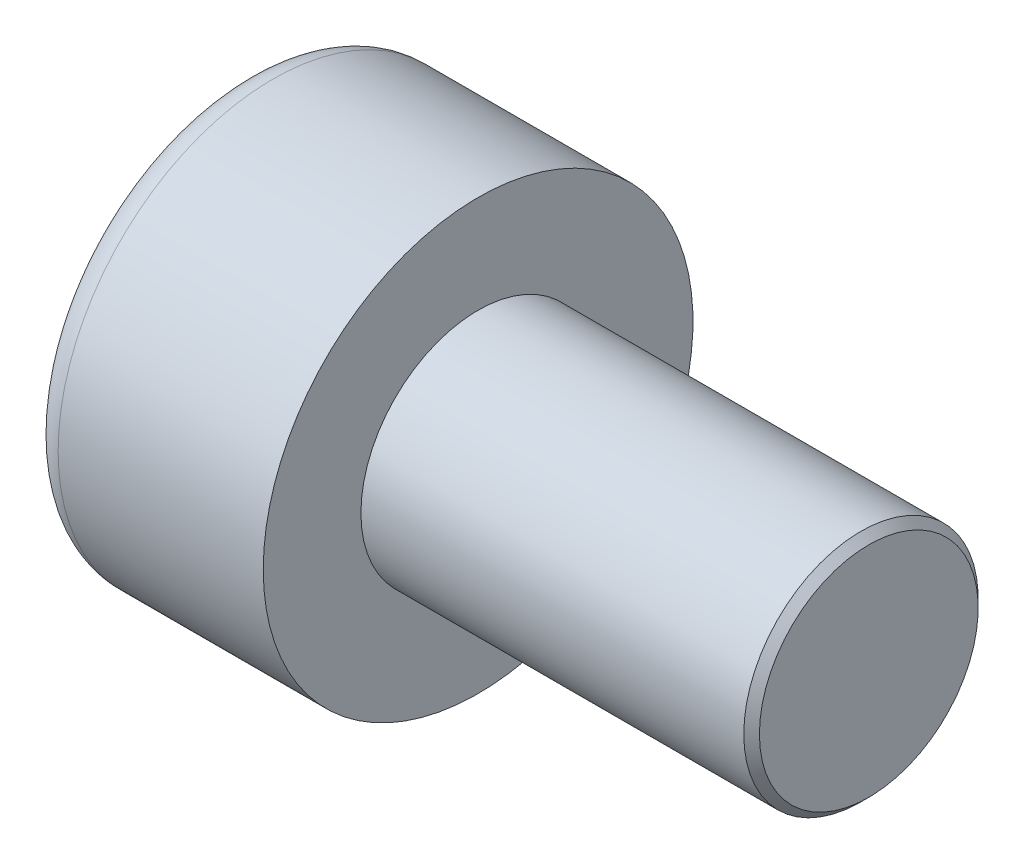
ISO-10303-21;
HEADER;
FILE_DESCRIPTION(('STEP AP214'),'2;1');
FILE_NAME('part.step','',(''),(''),'','','');
FILE_SCHEMA(('AUTOMOTIVE_DESIGN { 1 0 10303 214 1 1 1 1 }'));
ENDSEC;
DATA;
#1=APPLICATION_CONTEXT('core data for automotive mechanical design processes');
#2=APPLICATION_PROTOCOL_DEFINITION('international standard','automotive_design',2000,#1);
#3=PRODUCT_CONTEXT('',#1,'mechanical');
#4=PRODUCT('Part','Part','',(#3));
#5=PRODUCT_RELATED_PRODUCT_CATEGORY('part','',(#4));
#6=PRODUCT_DEFINITION_FORMATION('','',#4);
#7=PRODUCT_DEFINITION_CONTEXT('part definition',#1,'design');
#8=PRODUCT_DEFINITION('design','',#6,#7);
#9=PRODUCT_DEFINITION_SHAPE('','',#8);
#10=(LENGTH_UNIT() NAMED_UNIT(*) SI_UNIT(.MILLI.,.METRE.));
#11=(NAMED_UNIT(*) PLANE_ANGLE_UNIT() SI_UNIT($,.RADIAN.));
#12=(NAMED_UNIT(*) SI_UNIT($,.STERADIAN.) SOLID_ANGLE_UNIT());
#13=UNCERTAINTY_MEASURE_WITH_UNIT(LENGTH_MEASURE(1.E-05),#10,'distance_accuracy_value','');
#14=(GEOMETRIC_REPRESENTATION_CONTEXT(3) GLOBAL_UNCERTAINTY_ASSIGNED_CONTEXT((#13)) GLOBAL_UNIT_ASSIGNED_CONTEXT((#10,
#11,#12)) REPRESENTATION_CONTEXT('',''));
#15=CARTESIAN_POINT('',(0.,0.,0.));
#16=DIRECTION('',(0.,0.,1.));
#17=DIRECTION('',(1.,0.,0.));
#18=AXIS2_PLACEMENT_3D('',#15,#16,#17);
#19=CARTESIAN_POINT('',(1.30000000012842,0.,0.));
#20=DIRECTION('',(-1.,0.,0.));
#21=DIRECTION('',(0.,0.,1.));
#22=AXIS2_PLACEMENT_3D('',#19,#20,#21);
#23=CONICAL_SURFACE('',#22,1.2499999999136,1.04719755110928);
#24=CARTESIAN_POINT('',(2.02168783664547,0.,1.13686837721616E-10));
#25=VERTEX_POINT('',#24);
#26=VERTEX_LOOP('',#25);
#27=FACE_BOUND('',#26,.T.);
#28=CARTESIAN_POINT('',(1.30000000006278,0.,0.));
#29=DIRECTION('',(-1.,0.,0.));
#30=DIRECTION('',(0.,0.,1.));
#31=AXIS2_PLACEMENT_3D('',#28,#29,#30);
#32=CIRCLE('',#31,1.25000000002728);
#33=CARTESIAN_POINT('',(1.30000000003139,-0.625000000006822,1.08253175474236));
#34=VERTEX_POINT('',#33);
#35=CARTESIAN_POINT('',(1.30000000003139,0.625000000006821,1.08253175474236));
#36=VERTEX_POINT('',#35);
#37=EDGE_CURVE('E85',#34,#36,#32,.T.);
#38=ORIENTED_EDGE('',*,*,#37,.T.);
#39=CARTESIAN_POINT('',(1.30000000006278,0.,0.));
#40=DIRECTION('',(-1.,0.,0.));
#41=DIRECTION('',(0.,0.,1.));
#42=AXIS2_PLACEMENT_3D('',#39,#40,#41);
#43=CIRCLE('',#42,1.25000000002728);
#44=CARTESIAN_POINT('',(1.30000000003139,1.25000000001364,0.));
#45=VERTEX_POINT('',#44);
#46=EDGE_CURVE('E103',#36,#45,#43,.T.);
#47=ORIENTED_EDGE('',*,*,#46,.T.);
#48=CARTESIAN_POINT('',(1.30000000006278,0.,0.));
#49=DIRECTION('',(-1.,0.,0.));
#50=DIRECTION('',(0.,0.,1.));
#51=AXIS2_PLACEMENT_3D('',#48,#49,#50);
#52=CIRCLE('',#51,1.25000000002728);
#53=CARTESIAN_POINT('',(1.30000000003139,0.625000000006821,-1.08253175474236));
#54=VERTEX_POINT('',#53);
#55=EDGE_CURVE('E147',#45,#54,#52,.T.);
#56=ORIENTED_EDGE('',*,*,#55,.T.);
#57=CARTESIAN_POINT('',(1.30000000006278,0.,0.));
#58=DIRECTION('',(-1.,0.,0.));
#59=DIRECTION('',(0.,0.,1.));
#60=AXIS2_PLACEMENT_3D('',#57,#58,#59);
#61=CIRCLE('',#60,1.25000000002728);
#62=CARTESIAN_POINT('',(1.30000000003139,-0.625000000006821,-1.08253175474236));
#63=VERTEX_POINT('',#62);
#64=EDGE_CURVE('E135',#54,#63,#61,.T.);
#65=ORIENTED_EDGE('',*,*,#64,.T.);
#66=CARTESIAN_POINT('',(1.30000000006278,0.,0.));
#67=DIRECTION('',(-1.,0.,0.));
#68=DIRECTION('',(0.,0.,1.));
#69=AXIS2_PLACEMENT_3D('',#66,#67,#68);
#70=CIRCLE('',#69,1.25000000002728);
#71=CARTESIAN_POINT('',(1.30000000003139,-1.25000000001364,0.));
#72=VERTEX_POINT('',#71);
#73=EDGE_CURVE('E89',#63,#72,#70,.T.);
#74=ORIENTED_EDGE('',*,*,#73,.T.);
#75=CARTESIAN_POINT('',(1.30000000006278,0.,0.));
#76=DIRECTION('',(-1.,0.,0.));
#77=DIRECTION('',(0.,0.,1.));
#78=AXIS2_PLACEMENT_3D('',#75,#76,#77);
#79=CIRCLE('',#78,1.25000000002728);
#80=EDGE_CURVE('E83',#72,#34,#79,.T.);
#81=ORIENTED_EDGE('',*,*,#80,.T.);
#82=EDGE_LOOP('',(#38,#47,#56,#65,#74,#81));
#83=FACE_BOUND('',#82,.T.);
#84=ADVANCED_FACE('F17',(#27,#83),#23,.F.);
#85=CARTESIAN_POINT('',(1.3,0.,-1.44337567297406));
#86=DIRECTION('',(1.,0.,0.));
#87=DIRECTION('',(0.,0.,-1.));
#88=AXIS2_PLACEMENT_3D('',#85,#86,#87);
#89=PLANE('',#88);
#90=DIRECTION('',(0.,0.,1.));
#91=VECTOR('',#90,1.);
#92=CARTESIAN_POINT('',(1.3,-1.25,0.721687836487033));
#93=LINE('',#92,#91);
#94=CARTESIAN_POINT('',(1.3,-1.25,0.721687836487033));
#95=VERTEX_POINT('',#94);
#96=EDGE_CURVE('E109',#95,#72,#93,.F.);
#97=ORIENTED_EDGE('',*,*,#96,.F.);
#98=DIRECTION('',(0.,0.866025403784439,0.5));
#99=VECTOR('',#98,1.);
#100=CARTESIAN_POINT('',(1.3,0.,1.44337567297407));
#101=LINE('',#100,#99);
#102=EDGE_CURVE('E106',#34,#95,#101,.F.);
#103=ORIENTED_EDGE('',*,*,#102,.F.);
#104=ORIENTED_EDGE('',*,*,#80,.F.);
#105=EDGE_LOOP('',(#97,#103,#104));
#106=FACE_BOUND('',#105,.T.);
#107=ADVANCED_FACE('F107',(#106),#89,.F.);
#108=CARTESIAN_POINT('',(1.3,0.,-1.44337567297406));
#109=DIRECTION('',(1.,0.,0.));
#110=DIRECTION('',(0.,0.,-1.));
#111=AXIS2_PLACEMENT_3D('',#108,#109,#110);
#112=PLANE('',#111);
#113=DIRECTION('',(0.,0.866025403784439,0.5));
#114=VECTOR('',#113,1.);
#115=CARTESIAN_POINT('',(1.3,0.,1.44337567297407));
#116=LINE('',#115,#114);
#117=CARTESIAN_POINT('',(1.3,0.,1.44337567297407));
#118=VERTEX_POINT('',#117);
#119=EDGE_CURVE('E98',#118,#34,#116,.F.);
#120=ORIENTED_EDGE('',*,*,#119,.F.);
#121=DIRECTION('',(0.,0.866025403784439,-0.5));
#122=VECTOR('',#121,1.);
#123=CARTESIAN_POINT('',(1.3,1.25,0.721687836487033));
#124=LINE('',#123,#122);
#125=EDGE_CURVE('E101',#36,#118,#124,.F.);
#126=ORIENTED_EDGE('',*,*,#125,.F.);
#127=ORIENTED_EDGE('',*,*,#37,.F.);
#128=EDGE_LOOP('',(#120,#126,#127));
#129=FACE_BOUND('',#128,.T.);
#130=ADVANCED_FACE('F96',(#129),#112,.F.);
#131=CARTESIAN_POINT('',(1.3,0.,-1.44337567297406));
#132=DIRECTION('',(1.,0.,0.));
#133=DIRECTION('',(0.,0.,-1.));
#134=AXIS2_PLACEMENT_3D('',#131,#132,#133);
#135=PLANE('',#134);
#136=DIRECTION('',(0.,0.866025403784439,-0.5));
#137=VECTOR('',#136,1.);
#138=CARTESIAN_POINT('',(1.3,1.25,0.721687836487033));
#139=LINE('',#138,#137);
#140=CARTESIAN_POINT('',(1.3,1.25,0.721687836487033));
#141=VERTEX_POINT('',#140);
#142=EDGE_CURVE('E131',#141,#36,#139,.F.);
#143=ORIENTED_EDGE('',*,*,#142,.F.);
#144=DIRECTION('',(0.,0.,-1.));
#145=VECTOR('',#144,1.);
#146=CARTESIAN_POINT('',(1.3,1.25,-0.721687836487031));
#147=LINE('',#146,#145);
#148=EDGE_CURVE('E192',#45,#141,#147,.F.);
#149=ORIENTED_EDGE('',*,*,#148,.F.);
#150=ORIENTED_EDGE('',*,*,#46,.F.);
#151=EDGE_LOOP('',(#143,#149,#150));
#152=FACE_BOUND('',#151,.T.);
#153=ADVANCED_FACE('F402',(#152),#135,.F.);
#154=CARTESIAN_POINT('',(1.3,0.,-1.44337567297406));
#155=DIRECTION('',(1.,0.,0.));
#156=DIRECTION('',(0.,0.,-1.));
#157=AXIS2_PLACEMENT_3D('',#154,#155,#156);
#158=PLANE('',#157);
#159=DIRECTION('',(0.,0.,-1.));
#160=VECTOR('',#159,1.);
#161=CARTESIAN_POINT('',(1.3,1.25,-0.721687836487031));
#162=LINE('',#161,#160);
#163=CARTESIAN_POINT('',(1.3,1.25,-0.721687836487031));
#164=VERTEX_POINT('',#163);
#165=EDGE_CURVE('E189',#164,#45,#162,.F.);
#166=ORIENTED_EDGE('',*,*,#165,.F.);
#167=DIRECTION('',(0.,-0.866025403784438,-0.5));
#168=VECTOR('',#167,1.);
#169=CARTESIAN_POINT('',(1.3,0.,-1.44337567297406));
#170=LINE('',#169,#168);
#171=EDGE_CURVE('E177',#54,#164,#170,.F.);
#172=ORIENTED_EDGE('',*,*,#171,.F.);
#173=ORIENTED_EDGE('',*,*,#55,.F.);
#174=EDGE_LOOP('',(#166,#172,#173));
#175=FACE_BOUND('',#174,.T.);
#176=ADVANCED_FACE('F392',(#175),#158,.F.);
#177=CARTESIAN_POINT('',(1.3,0.,-1.44337567297406));
#178=DIRECTION('',(1.,0.,0.));
#179=DIRECTION('',(0.,0.,-1.));
#180=AXIS2_PLACEMENT_3D('',#177,#178,#179);
#181=PLANE('',#180);
#182=DIRECTION('',(0.,-0.866025403784439,0.5));
#183=VECTOR('',#182,1.);
#184=CARTESIAN_POINT('',(1.3,-1.25,-0.721687836487032));
#185=LINE('',#184,#183);
#186=CARTESIAN_POINT('',(1.3,-1.25,-0.721687836487032));
#187=VERTEX_POINT('',#186);
#188=EDGE_CURVE('E231',#187,#63,#185,.F.);
#189=ORIENTED_EDGE('',*,*,#188,.F.);
#190=DIRECTION('',(0.,0.,1.));
#191=VECTOR('',#190,1.);
#192=CARTESIAN_POINT('',(1.3,-1.25,0.721687836487033));
#193=LINE('',#192,#191);
#194=EDGE_CURVE('E119',#72,#187,#193,.F.);
#195=ORIENTED_EDGE('',*,*,#194,.F.);
#196=ORIENTED_EDGE('',*,*,#73,.F.);
#197=EDGE_LOOP('',(#189,#195,#196));
#198=FACE_BOUND('',#197,.T.);
#199=ADVANCED_FACE('F382',(#198),#181,.F.);
#200=CARTESIAN_POINT('',(1.3,0.,-1.44337567297406));
#201=DIRECTION('',(1.,0.,0.));
#202=DIRECTION('',(0.,0.,-1.));
#203=AXIS2_PLACEMENT_3D('',#200,#201,#202);
#204=PLANE('',#203);
#205=DIRECTION('',(0.,-0.866025403784438,-0.5));
#206=VECTOR('',#205,1.);
#207=CARTESIAN_POINT('',(1.3,0.,-1.44337567297406));
#208=LINE('',#207,#206);
#209=CARTESIAN_POINT('',(1.3,0.,-1.44337567297406));
#210=VERTEX_POINT('',#209);
#211=EDGE_CURVE('E181',#210,#54,#208,.F.);
#212=ORIENTED_EDGE('',*,*,#211,.F.);
#213=DIRECTION('',(0.,-0.866025403784439,0.5));
#214=VECTOR('',#213,1.);
#215=CARTESIAN_POINT('',(1.3,-1.25,-0.721687836487032));
#216=LINE('',#215,#214);
#217=EDGE_CURVE('E450',#63,#210,#216,.F.);
#218=ORIENTED_EDGE('',*,*,#217,.F.);
#219=ORIENTED_EDGE('',*,*,#64,.F.);
#220=EDGE_LOOP('',(#212,#218,#219));
#221=FACE_BOUND('',#220,.T.);
#222=ADVANCED_FACE('F372',(#221),#204,.F.);
#223=CARTESIAN_POINT('',(1.3,-1.25,0.721687836487033));
#224=DIRECTION('',(0.,1.,0.));
#225=DIRECTION('',(0.,0.,1.));
#226=AXIS2_PLACEMENT_3D('',#223,#224,#225);
#227=PLANE('',#226);
#228=ORIENTED_EDGE('',*,*,#194,.T.);
#229=DIRECTION('',(1.,0.,0.));
#230=VECTOR('',#229,1.);
#231=CARTESIAN_POINT('',(1.3,-1.25,-0.721687836487032));
#232=LINE('',#231,#230);
#233=CARTESIAN_POINT('',(0.,-1.25,-0.721687836487032));
#234=VERTEX_POINT('',#233);
#235=EDGE_CURVE('E186',#234,#187,#232,.T.);
#236=ORIENTED_EDGE('',*,*,#235,.F.);
#237=DIRECTION('',(0.,0.,-1.));
#238=VECTOR('',#237,1.);
#239=CARTESIAN_POINT('',(0.,-1.25,0.));
#240=LINE('',#239,#238);
#241=CARTESIAN_POINT('',(0.,-1.25,0.721687836487033));
#242=VERTEX_POINT('',#241);
#243=EDGE_CURVE('E170',#234,#242,#240,.F.);
#244=ORIENTED_EDGE('',*,*,#243,.T.);
#245=DIRECTION('',(1.,0.,0.));
#246=VECTOR('',#245,1.);
#247=CARTESIAN_POINT('',(1.3,-1.25,0.721687836487033));
#248=LINE('',#247,#246);
#249=EDGE_CURVE('E113',#95,#242,#248,.F.);
#250=ORIENTED_EDGE('',*,*,#249,.F.);
#251=ORIENTED_EDGE('',*,*,#96,.T.);
#252=EDGE_LOOP('',(#228,#236,#244,#250,#251));
#253=FACE_BOUND('',#252,.T.);
#254=ADVANCED_FACE('F363',(#253),#227,.T.);
#255=CARTESIAN_POINT('',(1.3,0.,1.44337567297407));
#256=DIRECTION('',(0.,0.5,-0.866025403784439));
#257=DIRECTION('',(0.,0.866025403784439,0.5));
#258=AXIS2_PLACEMENT_3D('',#255,#256,#257);
#259=PLANE('',#258);
#260=ORIENTED_EDGE('',*,*,#102,.T.);
#261=ORIENTED_EDGE('',*,*,#249,.T.);
#262=DIRECTION('',(0.,0.866025403784439,0.5));
#263=VECTOR('',#262,1.);
#264=CARTESIAN_POINT('',(0.,-1.25,0.721687836487033));
#265=LINE('',#264,#263);
#266=CARTESIAN_POINT('',(0.,0.,1.44337567297407));
#267=VERTEX_POINT('',#266);
#268=EDGE_CURVE('E173',#242,#267,#265,.T.);
#269=ORIENTED_EDGE('',*,*,#268,.T.);
#270=DIRECTION('',(1.,0.,0.));
#271=VECTOR('',#270,1.);
#272=CARTESIAN_POINT('',(1.3,0.,1.44337567297407));
#273=LINE('',#272,#271);
#274=EDGE_CURVE('E118',#118,#267,#273,.F.);
#275=ORIENTED_EDGE('',*,*,#274,.F.);
#276=ORIENTED_EDGE('',*,*,#119,.T.);
#277=EDGE_LOOP('',(#260,#261,#269,#275,#276));
#278=FACE_BOUND('',#277,.T.);
#279=ADVANCED_FACE('F115',(#278),#259,.T.);
#280=CARTESIAN_POINT('',(1.3,1.25,0.721687836487033));
#281=DIRECTION('',(0.,-0.5,-0.866025403784439));
#282=DIRECTION('',(0.,0.866025403784439,-0.5));
#283=AXIS2_PLACEMENT_3D('',#280,#281,#282);
#284=PLANE('',#283);
#285=ORIENTED_EDGE('',*,*,#125,.T.);
#286=ORIENTED_EDGE('',*,*,#274,.T.);
#287=DIRECTION('',(0.,0.866025403784439,-0.5));
#288=VECTOR('',#287,1.);
#289=CARTESIAN_POINT('',(0.,0.,1.44337567297407));
#290=LINE('',#289,#288);
#291=CARTESIAN_POINT('',(0.,1.25,0.721687836487033));
#292=VERTEX_POINT('',#291);
#293=EDGE_CURVE('E216',#267,#292,#290,.T.);
#294=ORIENTED_EDGE('',*,*,#293,.T.);
#295=DIRECTION('',(1.,0.,0.));
#296=VECTOR('',#295,1.);
#297=CARTESIAN_POINT('',(1.3,1.25,0.721687836487033));
#298=LINE('',#297,#296);
#299=EDGE_CURVE('E197',#141,#292,#298,.F.);
#300=ORIENTED_EDGE('',*,*,#299,.F.);
#301=ORIENTED_EDGE('',*,*,#142,.T.);
#302=EDGE_LOOP('',(#285,#286,#294,#300,#301));
#303=FACE_BOUND('',#302,.T.);
#304=ADVANCED_FACE('F213',(#303),#284,.T.);
#305=CARTESIAN_POINT('',(1.3,1.25,-0.721687836487031));
#306=DIRECTION('',(0.,-1.,0.));
#307=DIRECTION('',(0.,0.,-1.));
#308=AXIS2_PLACEMENT_3D('',#305,#306,#307);
#309=PLANE('',#308);
#310=ORIENTED_EDGE('',*,*,#148,.T.);
#311=ORIENTED_EDGE('',*,*,#299,.T.);
#312=DIRECTION('',(0.,0.,-1.));
#313=VECTOR('',#312,1.);
#314=CARTESIAN_POINT('',(0.,1.25,0.));
#315=LINE('',#314,#313);
#316=CARTESIAN_POINT('',(0.,1.25,-0.721687836487031));
#317=VERTEX_POINT('',#316);
#318=EDGE_CURVE('E163',#292,#317,#315,.T.);
#319=ORIENTED_EDGE('',*,*,#318,.T.);
#320=DIRECTION('',(1.,0.,0.));
#321=VECTOR('',#320,1.);
#322=CARTESIAN_POINT('',(1.3,1.25,-0.721687836487031));
#323=LINE('',#322,#321);
#324=EDGE_CURVE('E180',#164,#317,#323,.F.);
#325=ORIENTED_EDGE('',*,*,#324,.F.);
#326=ORIENTED_EDGE('',*,*,#165,.T.);
#327=EDGE_LOOP('',(#310,#311,#319,#325,#326));
#328=FACE_BOUND('',#327,.T.);
#329=ADVANCED_FACE('F336',(#328),#309,.T.);
#330=CARTESIAN_POINT('',(1.3,0.,-1.44337567297406));
#331=DIRECTION('',(0.,-0.5,0.866025403784438));
#332=DIRECTION('',(0.,-0.866025403784438,-0.5));
#333=AXIS2_PLACEMENT_3D('',#330,#331,#332);
#334=PLANE('',#333);
#335=ORIENTED_EDGE('',*,*,#171,.T.);
#336=ORIENTED_EDGE('',*,*,#324,.T.);
#337=DIRECTION('',(0.,-0.866025403784438,-0.5));
#338=VECTOR('',#337,1.);
#339=CARTESIAN_POINT('',(0.,1.25,-0.721687836487031));
#340=LINE('',#339,#338);
#341=CARTESIAN_POINT('',(0.,0.,-1.44337567297406));
#342=VERTEX_POINT('',#341);
#343=EDGE_CURVE('E155',#317,#342,#340,.T.);
#344=ORIENTED_EDGE('',*,*,#343,.T.);
#345=DIRECTION('',(1.,0.,0.));
#346=VECTOR('',#345,1.);
#347=CARTESIAN_POINT('',(1.3,0.,-1.44337567297406));
#348=LINE('',#347,#346);
#349=EDGE_CURVE('E174',#210,#342,#348,.F.);
#350=ORIENTED_EDGE('',*,*,#349,.F.);
#351=ORIENTED_EDGE('',*,*,#211,.T.);
#352=EDGE_LOOP('',(#335,#336,#344,#350,#351));
#353=FACE_BOUND('',#352,.T.);
#354=ADVANCED_FACE('F275',(#353),#334,.T.);
#355=CARTESIAN_POINT('',(1.3,-1.25,-0.721687836487032));
#356=DIRECTION('',(0.,0.5,0.866025403784439));
#357=DIRECTION('',(0.,-0.866025403784439,0.5));
#358=AXIS2_PLACEMENT_3D('',#355,#356,#357);
#359=PLANE('',#358);
#360=ORIENTED_EDGE('',*,*,#217,.T.);
#361=ORIENTED_EDGE('',*,*,#349,.T.);
#362=DIRECTION('',(0.,-0.866025403784439,0.5));
#363=VECTOR('',#362,1.);
#364=CARTESIAN_POINT('',(0.,0.,-1.44337567297406));
#365=LINE('',#364,#363);
#366=EDGE_CURVE('E153',#342,#234,#365,.T.);
#367=ORIENTED_EDGE('',*,*,#366,.T.);
#368=ORIENTED_EDGE('',*,*,#235,.T.);
#369=ORIENTED_EDGE('',*,*,#188,.T.);
#370=EDGE_LOOP('',(#360,#361,#367,#368,#369));
#371=FACE_BOUND('',#370,.T.);
#372=ADVANCED_FACE('F270',(#371),#359,.T.);
#373=CARTESIAN_POINT('',(0.,0.,0.));
#374=DIRECTION('',(1.,0.,0.));
#375=DIRECTION('',(0.,0.,-1.));
#376=AXIS2_PLACEMENT_3D('',#373,#374,#375);
#377=PLANE('',#376);
#378=ORIENTED_EDGE('',*,*,#343,.F.);
#379=ORIENTED_EDGE('',*,*,#318,.F.);
#380=ORIENTED_EDGE('',*,*,#293,.F.);
#381=ORIENTED_EDGE('',*,*,#268,.F.);
#382=ORIENTED_EDGE('',*,*,#243,.F.);
#383=ORIENTED_EDGE('',*,*,#366,.F.);
#384=EDGE_LOOP('',(#378,#379,#380,#381,#382,#383));
#385=FACE_BOUND('',#384,.T.);
#386=CARTESIAN_POINT('',(0.,0.,0.));
#387=DIRECTION('',(1.,0.,0.));
#388=DIRECTION('',(0.,0.,-1.));
#389=AXIS2_PLACEMENT_3D('',#386,#387,#388);
#390=CIRCLE('',#389,2.375);
#391=CARTESIAN_POINT('',(0.,0.,-2.375));
#392=VERTEX_POINT('',#391);
#393=CARTESIAN_POINT('',(0.,0.,2.375));
#394=VERTEX_POINT('',#393);
#395=EDGE_CURVE('E151',#392,#394,#390,.T.);
#396=ORIENTED_EDGE('',*,*,#395,.F.);
#397=CARTESIAN_POINT('',(0.,0.,0.));
#398=DIRECTION('',(1.,0.,0.));
#399=DIRECTION('',(0.,0.,1.));
#400=AXIS2_PLACEMENT_3D('',#397,#398,#399);
#401=CIRCLE('',#400,2.375);
#402=EDGE_CURVE('E36',#394,#392,#401,.T.);
#403=ORIENTED_EDGE('',*,*,#402,.F.);
#404=EDGE_LOOP('',(#396,#403));
#405=FACE_BOUND('',#404,.T.);
#406=ADVANCED_FACE('F222',(#385,#405),#377,.F.);
#407=CARTESIAN_POINT('',(0.375,0.,0.));
#408=DIRECTION('',(1.,0.,0.));
#409=DIRECTION('',(0.,0.,-1.));
#410=AXIS2_PLACEMENT_3D('',#407,#408,#409);
#411=TOROIDAL_SURFACE('',#410,2.375,0.375);
#412=CARTESIAN_POINT('',(0.375,0.,0.));
#413=DIRECTION('',(-1.,0.,0.));
#414=DIRECTION('',(0.,0.,1.));
#415=AXIS2_PLACEMENT_3D('',#412,#413,#414);
#416=CIRCLE('',#415,2.75);
#417=CARTESIAN_POINT('',(0.375,0.,2.75));
#418=VERTEX_POINT('',#417);
#419=EDGE_CURVE('E144',#418,#418,#416,.F.);
#420=ORIENTED_EDGE('',*,*,#419,.F.);
#421=EDGE_LOOP('',(#420));
#422=FACE_BOUND('',#421,.T.);
#423=ORIENTED_EDGE('',*,*,#395,.T.);
#424=ORIENTED_EDGE('',*,*,#402,.T.);
#425=EDGE_LOOP('',(#423,#424));
#426=FACE_BOUND('',#425,.T.);
#427=ADVANCED_FACE('F150',(#422,#426),#411,.T.);
#428=CARTESIAN_POINT('',(8.,0.,0.));
#429=DIRECTION('',(1.,0.,0.));
#430=DIRECTION('',(0.,0.,-1.));
#431=AXIS2_PLACEMENT_3D('',#428,#429,#430);
#432=PLANE('',#431);
#433=CARTESIAN_POINT('',(7.99999999992451,0.,0.));
#434=DIRECTION('',(-1.,0.,0.));
#435=DIRECTION('',(0.,0.,1.));
#436=AXIS2_PLACEMENT_3D('',#433,#434,#435);
#437=CIRCLE('',#436,1.39999999998963);
#438=CARTESIAN_POINT('',(7.99999999992451,0.,1.39999999998963));
#439=VERTEX_POINT('',#438);
#440=EDGE_CURVE('E141',#439,#439,#437,.T.);
#441=ORIENTED_EDGE('',*,*,#440,.F.);
#442=EDGE_LOOP('',(#441));
#443=FACE_BOUND('',#442,.T.);
#444=ADVANCED_FACE('F243',(#443),#432,.T.);
#445=CARTESIAN_POINT('',(3.,0.,0.));
#446=DIRECTION('',(-1.,0.,0.));
#447=DIRECTION('',(0.,0.,1.));
#448=AXIS2_PLACEMENT_3D('',#445,#446,#447);
#449=CYLINDRICAL_SURFACE('',#448,2.75);
#450=ORIENTED_EDGE('',*,*,#419,.T.);
#451=EDGE_LOOP('',(#450));
#452=FACE_BOUND('',#451,.T.);
#453=CARTESIAN_POINT('',(3.,0.,0.));
#454=DIRECTION('',(-1.,0.,0.));
#455=DIRECTION('',(0.,0.,1.));
#456=AXIS2_PLACEMENT_3D('',#453,#454,#455);
#457=CIRCLE('',#456,2.75);
#458=CARTESIAN_POINT('',(3.,0.,2.75));
#459=VERTEX_POINT('',#458);
#460=EDGE_CURVE('E138',#459,#459,#457,.F.);
#461=ORIENTED_EDGE('',*,*,#460,.F.);
#462=EDGE_LOOP('',(#461));
#463=FACE_BOUND('',#462,.T.);
#464=ADVANCED_FACE('F290',(#452,#463),#449,.T.);
#465=CARTESIAN_POINT('',(7.89999999994961,0.,0.));
#466=DIRECTION('',(-1.,0.,0.));
#467=DIRECTION('',(0.,0.,1.));
#468=AXIS2_PLACEMENT_3D('',#465,#466,#467);
#469=CONICAL_SURFACE('',#468,1.50000000002137,0.785398163681665);
#470=CARTESIAN_POINT('',(7.9,0.,0.));
#471=DIRECTION('',(-1.,0.,0.));
#472=DIRECTION('',(0.,0.,1.));
#473=AXIS2_PLACEMENT_3D('',#470,#471,#472);
#474=CIRCLE('',#473,1.5);
#475=CARTESIAN_POINT('',(7.9,0.,1.5));
#476=VERTEX_POINT('',#475);
#477=EDGE_CURVE('E28',#476,#476,#474,.T.);
#478=ORIENTED_EDGE('',*,*,#477,.F.);
#479=EDGE_LOOP('',(#478));
#480=FACE_BOUND('',#479,.T.);
#481=ORIENTED_EDGE('',*,*,#440,.T.);
#482=EDGE_LOOP('',(#481));
#483=FACE_BOUND('',#482,.T.);
#484=ADVANCED_FACE('F284',(#480,#483),#469,.T.);
#485=CARTESIAN_POINT('',(3.,0.,0.));
#486=DIRECTION('',(1.,0.,0.));
#487=DIRECTION('',(0.,0.,-1.));
#488=AXIS2_PLACEMENT_3D('',#485,#486,#487);
#489=PLANE('',#488);
#490=ORIENTED_EDGE('',*,*,#460,.T.);
#491=EDGE_LOOP('',(#490));
#492=FACE_BOUND('',#491,.T.);
#493=CARTESIAN_POINT('',(3.,0.,0.));
#494=DIRECTION('',(-1.,0.,0.));
#495=DIRECTION('',(0.,0.,1.));
#496=AXIS2_PLACEMENT_3D('',#493,#494,#495);
#497=CIRCLE('',#496,1.5);
#498=CARTESIAN_POINT('',(3.,0.,1.5));
#499=VERTEX_POINT('',#498);
#500=EDGE_CURVE('E11',#499,#499,#497,.F.);
#501=ORIENTED_EDGE('',*,*,#500,.F.);
#502=EDGE_LOOP('',(#501));
#503=FACE_BOUND('',#502,.T.);
#504=ADVANCED_FACE('F278',(#492,#503),#489,.T.);
#505=CARTESIAN_POINT('',(8.,0.,0.));
#506=DIRECTION('',(-1.,0.,0.));
#507=DIRECTION('',(0.,0.,1.));
#508=AXIS2_PLACEMENT_3D('',#505,#506,#507);
#509=CYLINDRICAL_SURFACE('',#508,1.5);
#510=ORIENTED_EDGE('',*,*,#500,.T.);
#511=EDGE_LOOP('',(#510));
#512=FACE_BOUND('',#511,.T.);
#513=ORIENTED_EDGE('',*,*,#477,.T.);
#514=EDGE_LOOP('',(#513));
#515=FACE_BOUND('',#514,.T.);
#516=ADVANCED_FACE('F276',(#512,#515),#509,.T.);
#517=CLOSED_SHELL('',(#84,#107,#130,#153,#176,#199,#222,#254,#279,#304,#329,#354,#372,#406,#427,
#444,#464,#484,#504,#516));
#518=MANIFOLD_SOLID_BREP('B1',#517);
#519=ADVANCED_BREP_SHAPE_REPRESENTATION('',(#18,#518),#14);
#520=SHAPE_DEFINITION_REPRESENTATION(#9,#519);
ENDSEC;
END-ISO-10303-21;
